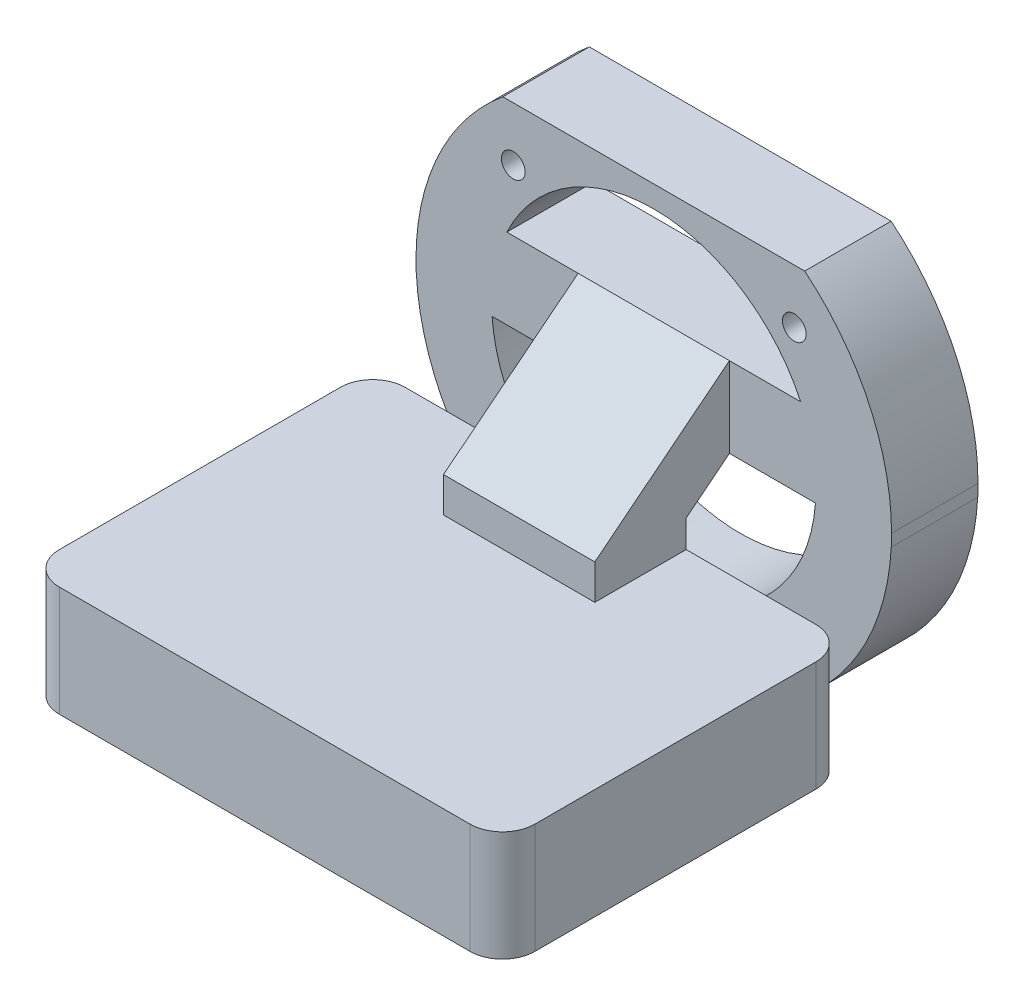
ISO-10303-21;
HEADER;
FILE_DESCRIPTION(('STEP AP214'),'2;1');
FILE_NAME('part.step','',(''),(''),'','','');
FILE_SCHEMA(('AUTOMOTIVE_DESIGN { 1 0 10303 214 1 1 1 1 }'));
ENDSEC;
DATA;
#1=APPLICATION_CONTEXT('core data for automotive mechanical design processes');
#2=APPLICATION_PROTOCOL_DEFINITION('international standard','automotive_design',2000,#1);
#3=PRODUCT_CONTEXT('',#1,'mechanical');
#4=PRODUCT('Part','Part','',(#3));
#5=PRODUCT_RELATED_PRODUCT_CATEGORY('part','',(#4));
#6=PRODUCT_DEFINITION_FORMATION('','',#4);
#7=PRODUCT_DEFINITION_CONTEXT('part definition',#1,'design');
#8=PRODUCT_DEFINITION('design','',#6,#7);
#9=PRODUCT_DEFINITION_SHAPE('','',#8);
#10=(LENGTH_UNIT() NAMED_UNIT(*) SI_UNIT(.MILLI.,.METRE.));
#11=(NAMED_UNIT(*) PLANE_ANGLE_UNIT() SI_UNIT($,.RADIAN.));
#12=(NAMED_UNIT(*) SI_UNIT($,.STERADIAN.) SOLID_ANGLE_UNIT());
#13=UNCERTAINTY_MEASURE_WITH_UNIT(LENGTH_MEASURE(1.E-05),#10,'distance_accuracy_value','');
#14=(GEOMETRIC_REPRESENTATION_CONTEXT(3) GLOBAL_UNCERTAINTY_ASSIGNED_CONTEXT((#13)) GLOBAL_UNIT_ASSIGNED_CONTEXT((#10,
#11,#12)) REPRESENTATION_CONTEXT('',''));
#15=CARTESIAN_POINT('',(0.,0.,0.));
#16=DIRECTION('',(0.,0.,1.));
#17=DIRECTION('',(1.,0.,0.));
#18=AXIS2_PLACEMENT_3D('',#15,#16,#17);
#19=CARTESIAN_POINT('',(22.,0.,0.));
#20=DIRECTION('',(-1.,0.,0.));
#21=DIRECTION('',(0.,0.,1.));
#22=AXIS2_PLACEMENT_3D('',#19,#20,#21);
#23=PLANE('',#22);
#24=DIRECTION('',(0.,0.,1.));
#25=VECTOR('',#24,1.);
#26=CARTESIAN_POINT('',(22.,0.,-7.));
#27=LINE('',#26,#25);
#28=CARTESIAN_POINT('',(22.,0.,0.));
#29=VERTEX_POINT('',#28);
#30=CARTESIAN_POINT('',(22.,0.,8.));
#31=VERTEX_POINT('',#30);
#32=EDGE_CURVE('E234',#29,#31,#27,.T.);
#33=ORIENTED_EDGE('',*,*,#32,.T.);
#34=DIRECTION('',(0.,-1.,0.));
#35=VECTOR('',#34,1.);
#36=CARTESIAN_POINT('',(22.,-6.79999999999999,8.));
#37=LINE('',#36,#35);
#38=CARTESIAN_POINT('',(22.,-1.09337336750485,8.));
#39=VERTEX_POINT('',#38);
#40=EDGE_CURVE('E245',#31,#39,#37,.T.);
#41=ORIENTED_EDGE('',*,*,#40,.T.);
#42=DIRECTION('',(0.,0.,-1.));
#43=VECTOR('',#42,1.);
#44=CARTESIAN_POINT('',(22.,-1.09337336750485,8.));
#45=LINE('',#44,#43);
#46=CARTESIAN_POINT('',(22.,-1.09337336750485,0.));
#47=VERTEX_POINT('',#46);
#48=EDGE_CURVE('E311',#39,#47,#45,.T.);
#49=ORIENTED_EDGE('',*,*,#48,.T.);
#50=DIRECTION('',(0.,1.,0.));
#51=VECTOR('',#50,1.);
#52=CARTESIAN_POINT('',(22.,-1.09337336750485,0.));
#53=LINE('',#52,#51);
#54=EDGE_CURVE('E248',#47,#29,#53,.T.);
#55=ORIENTED_EDGE('',*,*,#54,.T.);
#56=EDGE_LOOP('',(#33,#41,#49,#55));
#57=FACE_BOUND('',#56,.T.);
#58=ADVANCED_FACE('F43',(#57),#23,.F.);
#59=CARTESIAN_POINT('',(-22.,0.,0.));
#60=DIRECTION('',(-1.,0.,0.));
#61=DIRECTION('',(0.,0.,1.));
#62=AXIS2_PLACEMENT_3D('',#59,#60,#61);
#63=PLANE('',#62);
#64=DIRECTION('',(0.,-1.,0.));
#65=VECTOR('',#64,1.);
#66=CARTESIAN_POINT('',(-22.,-6.79999999999999,8.));
#67=LINE('',#66,#65);
#68=CARTESIAN_POINT('',(-22.,0.,8.));
#69=VERTEX_POINT('',#68);
#70=CARTESIAN_POINT('',(-22.,-1.09337336750485,8.));
#71=VERTEX_POINT('',#70);
#72=EDGE_CURVE('E273',#69,#71,#67,.T.);
#73=ORIENTED_EDGE('',*,*,#72,.F.);
#74=DIRECTION('',(0.,0.,1.));
#75=VECTOR('',#74,1.);
#76=CARTESIAN_POINT('',(-22.,0.,-7.));
#77=LINE('',#76,#75);
#78=CARTESIAN_POINT('',(-22.,0.,0.));
#79=VERTEX_POINT('',#78);
#80=EDGE_CURVE('E424',#69,#79,#77,.F.);
#81=ORIENTED_EDGE('',*,*,#80,.T.);
#82=DIRECTION('',(0.,1.,0.));
#83=VECTOR('',#82,1.);
#84=CARTESIAN_POINT('',(-22.,-1.09337336750485,0.));
#85=LINE('',#84,#83);
#86=CARTESIAN_POINT('',(-22.,-1.09337336750485,0.));
#87=VERTEX_POINT('',#86);
#88=EDGE_CURVE('E302',#87,#79,#85,.T.);
#89=ORIENTED_EDGE('',*,*,#88,.F.);
#90=DIRECTION('',(0.,0.,-1.));
#91=VECTOR('',#90,1.);
#92=CARTESIAN_POINT('',(-22.,-1.09337336750485,8.));
#93=LINE('',#92,#91);
#94=EDGE_CURVE('E299',#71,#87,#93,.T.);
#95=ORIENTED_EDGE('',*,*,#94,.F.);
#96=EDGE_LOOP('',(#73,#81,#89,#95));
#97=FACE_BOUND('',#96,.T.);
#98=ADVANCED_FACE('F546',(#97),#63,.T.);
#99=CARTESIAN_POINT('',(22.,-4.27256744270624,12.));
#100=DIRECTION('',(0.,0.782851196509347,0.62220897142671));
#101=DIRECTION('',(0.,-0.62220897142671,0.782851196509347));
#102=AXIS2_PLACEMENT_3D('',#99,#100,#101);
#103=PLANE('',#102);
#104=DIRECTION('',(0.,0.62220897142671,-0.782851196509347));
#105=VECTOR('',#104,1.);
#106=CARTESIAN_POINT('',(7.,-4.27256744270624,12.));
#107=LINE('',#106,#105);
#108=CARTESIAN_POINT('',(7.,-4.27256744270624,12.));
#109=VERTEX_POINT('',#108);
#110=CARTESIAN_POINT('',(7.,-1.09337336750485,8.));
#111=VERTEX_POINT('',#110);
#112=EDGE_CURVE('E269',#109,#111,#107,.T.);
#113=ORIENTED_EDGE('',*,*,#112,.F.);
#114=DIRECTION('',(-1.,0.,0.));
#115=VECTOR('',#114,1.);
#116=CARTESIAN_POINT('',(22.,-4.27256744270624,12.));
#117=LINE('',#116,#115);
#118=CARTESIAN_POINT('',(-7.,-4.27256744270624,12.));
#119=VERTEX_POINT('',#118);
#120=EDGE_CURVE('E344',#109,#119,#117,.T.);
#121=ORIENTED_EDGE('',*,*,#120,.T.);
#122=DIRECTION('',(0.,-0.62220897142671,0.782851196509347));
#123=VECTOR('',#122,1.);
#124=CARTESIAN_POINT('',(-7.,-4.27256744270624,12.));
#125=LINE('',#124,#123);
#126=CARTESIAN_POINT('',(-7.,-1.09337336750485,8.));
#127=VERTEX_POINT('',#126);
#128=EDGE_CURVE('E293',#127,#119,#125,.T.);
#129=ORIENTED_EDGE('',*,*,#128,.F.);
#130=DIRECTION('',(-1.,0.,0.));
#131=VECTOR('',#130,1.);
#132=CARTESIAN_POINT('',(22.,-1.09337336750485,8.));
#133=LINE('',#132,#131);
#134=EDGE_CURVE('E346',#111,#127,#133,.T.);
#135=ORIENTED_EDGE('',*,*,#134,.F.);
#136=EDGE_LOOP('',(#113,#121,#129,#135));
#137=FACE_BOUND('',#136,.T.);
#138=ADVANCED_FACE('F505',(#137),#103,.F.);
#139=CARTESIAN_POINT('',(22.,6.34006583254671,8.));
#140=DIRECTION('',(0.,-0.782851196509347,-0.62220897142671));
#141=DIRECTION('',(0.,0.62220897142671,-0.782851196509347));
#142=AXIS2_PLACEMENT_3D('',#139,#140,#141);
#143=PLANE('',#142);
#144=DIRECTION('',(0.,-0.62220897142671,0.782851196509347));
#145=VECTOR('',#144,1.);
#146=CARTESIAN_POINT('',(7.,6.34006583254671,8.));
#147=LINE('',#146,#145);
#148=CARTESIAN_POINT('',(7.,6.34006583254671,8.));
#149=VERTEX_POINT('',#148);
#150=CARTESIAN_POINT('',(7.,-3.55952705647791,20.4554747585172));
#151=VERTEX_POINT('',#150);
#152=EDGE_CURVE('E271',#149,#151,#147,.T.);
#153=ORIENTED_EDGE('',*,*,#152,.F.);
#154=DIRECTION('',(-1.,0.,0.));
#155=VECTOR('',#154,1.);
#156=CARTESIAN_POINT('',(22.,6.34006583254671,8.));
#157=LINE('',#156,#155);
#158=CARTESIAN_POINT('',(-7.,6.34006583254671,8.));
#159=VERTEX_POINT('',#158);
#160=EDGE_CURVE('E332',#149,#159,#157,.T.);
#161=ORIENTED_EDGE('',*,*,#160,.T.);
#162=DIRECTION('',(0.,0.62220897142671,-0.782851196509347));
#163=VECTOR('',#162,1.);
#164=CARTESIAN_POINT('',(-7.,6.34006583254671,8.));
#165=LINE('',#164,#163);
#166=CARTESIAN_POINT('',(-7.,-3.55952705647791,20.4554747585172));
#167=VERTEX_POINT('',#166);
#168=EDGE_CURVE('E290',#167,#159,#165,.T.);
#169=ORIENTED_EDGE('',*,*,#168,.F.);
#170=DIRECTION('',(-1.,0.,0.));
#171=VECTOR('',#170,1.);
#172=CARTESIAN_POINT('',(22.,-3.55952705647791,20.4554747585172));
#173=LINE('',#172,#171);
#174=EDGE_CURVE('E330',#151,#167,#173,.T.);
#175=ORIENTED_EDGE('',*,*,#174,.F.);
#176=EDGE_LOOP('',(#153,#161,#169,#175));
#177=FACE_BOUND('',#176,.T.);
#178=ADVANCED_FACE('F531',(#177),#143,.F.);
#179=CARTESIAN_POINT('',(22.,-3.55952705647791,20.4554747585172));
#180=DIRECTION('',(0.,0.,-1.));
#181=DIRECTION('',(-1.,0.,0.));
#182=AXIS2_PLACEMENT_3D('',#179,#180,#181);
#183=PLANE('',#182);
#184=DIRECTION('',(0.,1.,0.));
#185=VECTOR('',#184,1.);
#186=CARTESIAN_POINT('',(7.,-6.79999999999999,20.4554747585172));
#187=LINE('',#186,#185);
#188=CARTESIAN_POINT('',(7.,-6.79999999999999,20.4554747585172));
#189=VERTEX_POINT('',#188);
#190=EDGE_CURVE('E256',#189,#151,#187,.T.);
#191=ORIENTED_EDGE('',*,*,#190,.T.);
#192=ORIENTED_EDGE('',*,*,#174,.T.);
#193=DIRECTION('',(0.,1.,0.));
#194=VECTOR('',#193,1.);
#195=CARTESIAN_POINT('',(-7.,-6.79999999999999,20.4554747585172));
#196=LINE('',#195,#194);
#197=CARTESIAN_POINT('',(-7.,-6.79999999999999,20.4554747585172));
#198=VERTEX_POINT('',#197);
#199=EDGE_CURVE('E274',#198,#167,#196,.T.);
#200=ORIENTED_EDGE('',*,*,#199,.F.);
#201=DIRECTION('',(-1.,0.,0.));
#202=VECTOR('',#201,1.);
#203=CARTESIAN_POINT('',(22.,-6.79999999999999,20.4554747585172));
#204=LINE('',#203,#202);
#205=EDGE_CURVE('E328',#189,#198,#204,.T.);
#206=ORIENTED_EDGE('',*,*,#205,.F.);
#207=EDGE_LOOP('',(#191,#192,#200,#206));
#208=FACE_BOUND('',#207,.T.);
#209=ADVANCED_FACE('F534',(#208),#183,.F.);
#210=CARTESIAN_POINT('',(22.,-6.79999999999999,12.));
#211=DIRECTION('',(0.,0.,1.));
#212=DIRECTION('',(1.,0.,0.));
#213=AXIS2_PLACEMENT_3D('',#210,#211,#212);
#214=PLANE('',#213);
#215=DIRECTION('',(-1.,0.,0.));
#216=VECTOR('',#215,1.);
#217=CARTESIAN_POINT('',(22.,-17.,12.));
#218=LINE('',#217,#216);
#219=CARTESIAN_POINT('',(19.,-17.,12.));
#220=VERTEX_POINT('',#219);
#221=CARTESIAN_POINT('',(-19.,-17.,12.));
#222=VERTEX_POINT('',#221);
#223=EDGE_CURVE('E319',#220,#222,#218,.T.);
#224=ORIENTED_EDGE('',*,*,#223,.T.);
#225=DIRECTION('',(0.,1.,0.));
#226=VECTOR('',#225,1.);
#227=CARTESIAN_POINT('',(-19.,-6.79999999999999,12.));
#228=LINE('',#227,#226);
#229=CARTESIAN_POINT('',(-19.,-6.79999999999999,12.));
#230=VERTEX_POINT('',#229);
#231=EDGE_CURVE('E436',#222,#230,#228,.T.);
#232=ORIENTED_EDGE('',*,*,#231,.T.);
#233=DIRECTION('',(1.,0.,0.));
#234=VECTOR('',#233,1.);
#235=CARTESIAN_POINT('',(22.,-6.79999999999999,12.));
#236=LINE('',#235,#234);
#237=CARTESIAN_POINT('',(-7.,-6.79999999999999,12.));
#238=VERTEX_POINT('',#237);
#239=EDGE_CURVE('E288',#230,#238,#236,.T.);
#240=ORIENTED_EDGE('',*,*,#239,.T.);
#241=DIRECTION('',(0.,-1.,0.));
#242=VECTOR('',#241,1.);
#243=CARTESIAN_POINT('',(-7.,-6.79999999999999,12.));
#244=LINE('',#243,#242);
#245=EDGE_CURVE('E296',#119,#238,#244,.T.);
#246=ORIENTED_EDGE('',*,*,#245,.F.);
#247=ORIENTED_EDGE('',*,*,#120,.F.);
#248=DIRECTION('',(0.,1.,0.));
#249=VECTOR('',#248,1.);
#250=CARTESIAN_POINT('',(7.,-6.79999999999999,12.));
#251=LINE('',#250,#249);
#252=CARTESIAN_POINT('',(7.,-6.79999999999999,12.));
#253=VERTEX_POINT('',#252);
#254=EDGE_CURVE('E267',#253,#109,#251,.T.);
#255=ORIENTED_EDGE('',*,*,#254,.F.);
#256=DIRECTION('',(-1.,0.,0.));
#257=VECTOR('',#256,1.);
#258=CARTESIAN_POINT('',(22.,-6.79999999999999,12.));
#259=LINE('',#258,#257);
#260=CARTESIAN_POINT('',(19.,-6.79999999999999,12.));
#261=VERTEX_POINT('',#260);
#262=EDGE_CURVE('E265',#261,#253,#259,.T.);
#263=ORIENTED_EDGE('',*,*,#262,.F.);
#264=DIRECTION('',(0.,1.,0.));
#265=VECTOR('',#264,1.);
#266=CARTESIAN_POINT('',(19.,-6.79999999999999,12.));
#267=LINE('',#266,#265);
#268=EDGE_CURVE('E430',#261,#220,#267,.F.);
#269=ORIENTED_EDGE('',*,*,#268,.T.);
#270=EDGE_LOOP('',(#224,#232,#240,#246,#247,#255,#263,#269));
#271=FACE_BOUND('',#270,.T.);
#272=ADVANCED_FACE('F489',(#271),#214,.F.);
#273=DIRECTION('',(0.,0.,-1.));
#274=VECTOR('',#273,1.);
#275=CARTESIAN_POINT('',(22.,-17.,12.));
#276=LINE('',#275,#274);
#277=CARTESIAN_POINT('',(22.,-17.,41.));
#278=VERTEX_POINT('',#277);
#279=CARTESIAN_POINT('',(22.,-17.,15.));
#280=VERTEX_POINT('',#279);
#281=EDGE_CURVE('E317',#278,#280,#276,.T.);
#282=ORIENTED_EDGE('',*,*,#281,.T.);
#283=DIRECTION('',(0.,1.,0.));
#284=VECTOR('',#283,1.);
#285=CARTESIAN_POINT('',(22.,0.,15.));
#286=LINE('',#285,#284);
#287=CARTESIAN_POINT('',(22.,-6.79999999999999,15.));
#288=VERTEX_POINT('',#287);
#289=EDGE_CURVE('E11',#280,#288,#286,.T.);
#290=ORIENTED_EDGE('',*,*,#289,.T.);
#291=DIRECTION('',(0.,0.,1.));
#292=VECTOR('',#291,1.);
#293=CARTESIAN_POINT('',(22.,-6.79999999999999,20.4554747585172));
#294=LINE('',#293,#292);
#295=CARTESIAN_POINT('',(22.,-6.8,41.));
#296=VERTEX_POINT('',#295);
#297=EDGE_CURVE('E314',#288,#296,#294,.T.);
#298=ORIENTED_EDGE('',*,*,#297,.T.);
#299=DIRECTION('',(0.,-1.,0.));
#300=VECTOR('',#299,1.);
#301=CARTESIAN_POINT('',(22.,0.,41.));
#302=LINE('',#301,#300);
#303=EDGE_CURVE('E51',#296,#278,#302,.T.);
#304=ORIENTED_EDGE('',*,*,#303,.T.);
#305=EDGE_LOOP('',(#282,#290,#298,#304));
#306=FACE_BOUND('',#305,.T.);
#307=ADVANCED_FACE('F462',(#306),#23,.F.);
#308=DIRECTION('',(0.,0.,1.));
#309=VECTOR('',#308,1.);
#310=CARTESIAN_POINT('',(-22.,-6.79999999999999,20.4554747585172));
#311=LINE('',#310,#309);
#312=CARTESIAN_POINT('',(-22.,-6.79999999999999,15.));
#313=VERTEX_POINT('',#312);
#314=CARTESIAN_POINT('',(-22.,-6.8,41.));
#315=VERTEX_POINT('',#314);
#316=EDGE_CURVE('E305',#313,#315,#311,.T.);
#317=ORIENTED_EDGE('',*,*,#316,.F.);
#318=DIRECTION('',(0.,1.,0.));
#319=VECTOR('',#318,1.);
#320=CARTESIAN_POINT('',(-22.,-17.,15.));
#321=LINE('',#320,#319);
#322=CARTESIAN_POINT('',(-22.,-17.,15.));
#323=VERTEX_POINT('',#322);
#324=EDGE_CURVE('E449',#313,#323,#321,.F.);
#325=ORIENTED_EDGE('',*,*,#324,.T.);
#326=DIRECTION('',(0.,0.,-1.));
#327=VECTOR('',#326,1.);
#328=CARTESIAN_POINT('',(-22.,-17.,12.));
#329=LINE('',#328,#327);
#330=CARTESIAN_POINT('',(-22.,-17.,41.));
#331=VERTEX_POINT('',#330);
#332=EDGE_CURVE('E308',#331,#323,#329,.T.);
#333=ORIENTED_EDGE('',*,*,#332,.F.);
#334=DIRECTION('',(0.,-1.,0.));
#335=VECTOR('',#334,1.);
#336=CARTESIAN_POINT('',(-22.,-6.8,41.));
#337=LINE('',#336,#335);
#338=EDGE_CURVE('E447',#331,#315,#337,.F.);
#339=ORIENTED_EDGE('',*,*,#338,.T.);
#340=EDGE_LOOP('',(#317,#325,#333,#339));
#341=FACE_BOUND('',#340,.T.);
#342=ADVANCED_FACE('F483',(#341),#63,.T.);
#343=CARTESIAN_POINT('',(0.,0.,8.));
#344=DIRECTION('',(0.,0.,1.));
#345=DIRECTION('',(1.,0.,0.));
#346=AXIS2_PLACEMENT_3D('',#343,#344,#345);
#347=PLANE('',#346);
#348=ORIENTED_EDGE('',*,*,#40,.F.);
#349=CARTESIAN_POINT('',(0.,0.,8.));
#350=DIRECTION('',(0.,0.,1.));
#351=DIRECTION('',(1.,0.,0.));
#352=AXIS2_PLACEMENT_3D('',#349,#350,#351);
#353=CIRCLE('',#352,22.);
#354=CARTESIAN_POINT('',(13.9642400437689,17.,8.));
#355=VERTEX_POINT('',#354);
#356=EDGE_CURVE('E231',#31,#355,#353,.T.);
#357=ORIENTED_EDGE('',*,*,#356,.T.);
#358=DIRECTION('',(-1.,0.,0.));
#359=VECTOR('',#358,1.);
#360=CARTESIAN_POINT('',(13.9642400437689,17.,8.));
#361=LINE('',#360,#359);
#362=CARTESIAN_POINT('',(-13.9642400437689,17.,8.));
#363=VERTEX_POINT('',#362);
#364=EDGE_CURVE('E390',#355,#363,#361,.T.);
#365=ORIENTED_EDGE('',*,*,#364,.T.);
#366=CARTESIAN_POINT('',(0.,0.,8.));
#367=DIRECTION('',(0.,0.,1.));
#368=DIRECTION('',(1.,0.,0.));
#369=AXIS2_PLACEMENT_3D('',#366,#367,#368);
#370=CIRCLE('',#369,22.);
#371=EDGE_CURVE('E386',#363,#69,#370,.T.);
#372=ORIENTED_EDGE('',*,*,#371,.T.);
#373=ORIENTED_EDGE('',*,*,#72,.T.);
#374=CARTESIAN_POINT('',(-21.9728135358045,-1.09337336750485,8.));
#375=VERTEX_POINT('',#374);
#376=EDGE_CURVE('E341',#375,#71,#133,.T.);
#377=ORIENTED_EDGE('',*,*,#376,.F.);
#378=CARTESIAN_POINT('',(-13.9642400437689,-17.,8.));
#379=VERTEX_POINT('',#378);
#380=EDGE_CURVE('E388',#375,#379,#370,.T.);
#381=ORIENTED_EDGE('',*,*,#380,.T.);
#382=DIRECTION('',(1.,0.,0.));
#383=VECTOR('',#382,1.);
#384=CARTESIAN_POINT('',(13.9642400437689,-17.,8.));
#385=LINE('',#384,#383);
#386=CARTESIAN_POINT('',(13.9642400437689,-17.,8.));
#387=VERTEX_POINT('',#386);
#388=EDGE_CURVE('E242',#379,#387,#385,.T.);
#389=ORIENTED_EDGE('',*,*,#388,.T.);
#390=CARTESIAN_POINT('',(21.9728135358045,-1.09337336750485,8.));
#391=VERTEX_POINT('',#390);
#392=EDGE_CURVE('E241',#387,#391,#353,.T.);
#393=ORIENTED_EDGE('',*,*,#392,.T.);
#394=EDGE_CURVE('E254',#39,#391,#133,.T.);
#395=ORIENTED_EDGE('',*,*,#394,.F.);
#396=EDGE_LOOP('',(#348,#357,#365,#372,#373,#377,#381,#389,#393,#395));
#397=FACE_BOUND('',#396,.T.);
#398=CARTESIAN_POINT('',(14.9600980838774,-1.09337336750485,8.));
#399=VERTEX_POINT('',#398);
#400=EDGE_CURVE('E345',#399,#111,#133,.T.);
#401=ORIENTED_EDGE('',*,*,#400,.F.);
#402=CARTESIAN_POINT('',(0.,0.,8.));
#403=DIRECTION('',(0.,0.,1.));
#404=DIRECTION('',(1.,0.,0.));
#405=AXIS2_PLACEMENT_3D('',#402,#403,#404);
#406=CIRCLE('',#405,15.);
#407=CARTESIAN_POINT('',(-14.9600980838774,-1.09337336750485,8.));
#408=VERTEX_POINT('',#407);
#409=EDGE_CURVE('E382',#408,#399,#406,.T.);
#410=ORIENTED_EDGE('',*,*,#409,.F.);
#411=DIRECTION('',(-1.,0.,0.));
#412=VECTOR('',#411,1.);
#413=CARTESIAN_POINT('',(22.,-1.09337336750485,8.));
#414=LINE('',#413,#412);
#415=EDGE_CURVE('E286',#127,#408,#414,.T.);
#416=ORIENTED_EDGE('',*,*,#415,.F.);
#417=DIRECTION('',(0.,-1.,0.));
#418=VECTOR('',#417,1.);
#419=CARTESIAN_POINT('',(-7.,-6.79999999999999,8.));
#420=LINE('',#419,#418);
#421=EDGE_CURVE('E277',#159,#127,#420,.T.);
#422=ORIENTED_EDGE('',*,*,#421,.F.);
#423=DIRECTION('',(-1.,0.,0.));
#424=VECTOR('',#423,1.);
#425=CARTESIAN_POINT('',(-7.,6.34006583254671,8.));
#426=LINE('',#425,#424);
#427=CARTESIAN_POINT('',(-13.5942475054331,6.34006583254671,8.));
#428=VERTEX_POINT('',#427);
#429=EDGE_CURVE('E283',#159,#428,#426,.T.);
#430=ORIENTED_EDGE('',*,*,#429,.T.);
#431=CARTESIAN_POINT('',(13.5942475054331,6.34006583254671,8.));
#432=VERTEX_POINT('',#431);
#433=EDGE_CURVE('E378',#432,#428,#406,.T.);
#434=ORIENTED_EDGE('',*,*,#433,.F.);
#435=EDGE_CURVE('E334',#432,#149,#157,.T.);
#436=ORIENTED_EDGE('',*,*,#435,.T.);
#437=DIRECTION('',(0.,-1.,0.));
#438=VECTOR('',#437,1.);
#439=CARTESIAN_POINT('',(7.,-6.79999999999999,8.));
#440=LINE('',#439,#438);
#441=EDGE_CURVE('E263',#149,#111,#440,.T.);
#442=ORIENTED_EDGE('',*,*,#441,.T.);
#443=EDGE_LOOP('',(#401,#410,#416,#422,#430,#434,#436,#442));
#444=FACE_BOUND('',#443,.T.);
#445=CARTESIAN_POINT('',(13.,12.,8.));
#446=DIRECTION('',(0.,0.,1.));
#447=DIRECTION('',(1.,0.,0.));
#448=AXIS2_PLACEMENT_3D('',#445,#446,#447);
#449=CIRCLE('',#448,1.1);
#450=CARTESIAN_POINT('',(14.1,12.,8.));
#451=VERTEX_POINT('',#450);
#452=EDGE_CURVE('E366',#451,#451,#449,.T.);
#453=ORIENTED_EDGE('',*,*,#452,.F.);
#454=EDGE_LOOP('',(#453));
#455=FACE_BOUND('',#454,.T.);
#456=CARTESIAN_POINT('',(-13.,12.,8.));
#457=DIRECTION('',(0.,0.,1.));
#458=DIRECTION('',(1.,0.,0.));
#459=AXIS2_PLACEMENT_3D('',#456,#457,#458);
#460=CIRCLE('',#459,1.1);
#461=CARTESIAN_POINT('',(-11.9,12.,8.));
#462=VERTEX_POINT('',#461);
#463=EDGE_CURVE('E372',#462,#462,#460,.T.);
#464=ORIENTED_EDGE('',*,*,#463,.F.);
#465=EDGE_LOOP('',(#464));
#466=FACE_BOUND('',#465,.T.);
#467=CARTESIAN_POINT('',(13.,-12.,8.));
#468=DIRECTION('',(0.,0.,1.));
#469=DIRECTION('',(1.,0.,0.));
#470=AXIS2_PLACEMENT_3D('',#467,#468,#469);
#471=CIRCLE('',#470,1.1);
#472=CARTESIAN_POINT('',(14.1,-12.,8.));
#473=VERTEX_POINT('',#472);
#474=EDGE_CURVE('E360',#473,#473,#471,.T.);
#475=ORIENTED_EDGE('',*,*,#474,.F.);
#476=EDGE_LOOP('',(#475));
#477=FACE_BOUND('',#476,.T.);
#478=CARTESIAN_POINT('',(-13.,-12.,8.));
#479=DIRECTION('',(0.,0.,1.));
#480=DIRECTION('',(1.,0.,0.));
#481=AXIS2_PLACEMENT_3D('',#478,#479,#480);
#482=CIRCLE('',#481,1.1);
#483=CARTESIAN_POINT('',(-11.9,-12.,8.));
#484=VERTEX_POINT('',#483);
#485=EDGE_CURVE('E354',#484,#484,#482,.T.);
#486=ORIENTED_EDGE('',*,*,#485,.F.);
#487=EDGE_LOOP('',(#486));
#488=FACE_BOUND('',#487,.T.);
#489=ADVANCED_FACE('F251',(#397,#444,#455,#466,#477,#488),#347,.T.);
#490=CARTESIAN_POINT('',(0.,0.,8.));
#491=DIRECTION('',(0.,0.,-1.));
#492=DIRECTION('',(-1.,0.,0.));
#493=AXIS2_PLACEMENT_3D('',#490,#491,#492);
#494=CYLINDRICAL_SURFACE('',#493,22.);
#495=DIRECTION('',(0.,0.,-1.));
#496=VECTOR('',#495,1.);
#497=CARTESIAN_POINT('',(-21.9728135358045,-1.09337336750485,8.));
#498=LINE('',#497,#496);
#499=CARTESIAN_POINT('',(-21.9728135358045,-1.09337336750485,0.));
#500=VERTEX_POINT('',#499);
#501=EDGE_CURVE('E350',#500,#375,#498,.F.);
#502=ORIENTED_EDGE('',*,*,#501,.F.);
#503=CARTESIAN_POINT('',(0.,0.,0.));
#504=DIRECTION('',(0.,0.,1.));
#505=DIRECTION('',(1.,0.,0.));
#506=AXIS2_PLACEMENT_3D('',#503,#504,#505);
#507=CIRCLE('',#506,22.);
#508=CARTESIAN_POINT('',(-13.9642400437689,-17.,0.));
#509=VERTEX_POINT('',#508);
#510=EDGE_CURVE('E381',#500,#509,#507,.T.);
#511=ORIENTED_EDGE('',*,*,#510,.T.);
#512=DIRECTION('',(0.,0.,-1.));
#513=VECTOR('',#512,1.);
#514=CARTESIAN_POINT('',(-13.9642400437689,-17.,8.));
#515=LINE('',#514,#513);
#516=EDGE_CURVE('E409',#379,#509,#515,.T.);
#517=ORIENTED_EDGE('',*,*,#516,.F.);
#518=ORIENTED_EDGE('',*,*,#380,.F.);
#519=EDGE_LOOP('',(#502,#511,#517,#518));
#520=FACE_BOUND('',#519,.T.);
#521=ADVANCED_FACE('F563',(#520),#494,.T.);
#522=CARTESIAN_POINT('',(-13.9642400437689,17.,0.));
#523=VERTEX_POINT('',#522);
#524=EDGE_CURVE('E393',#523,#79,#507,.T.);
#525=ORIENTED_EDGE('',*,*,#524,.T.);
#526=ORIENTED_EDGE('',*,*,#80,.F.);
#527=ORIENTED_EDGE('',*,*,#371,.F.);
#528=DIRECTION('',(0.,0.,-1.));
#529=VECTOR('',#528,1.);
#530=CARTESIAN_POINT('',(-13.9642400437689,17.,8.));
#531=LINE('',#530,#529);
#532=EDGE_CURVE('E392',#363,#523,#531,.T.);
#533=ORIENTED_EDGE('',*,*,#532,.T.);
#534=EDGE_LOOP('',(#525,#526,#527,#533));
#535=FACE_BOUND('',#534,.T.);
#536=ADVANCED_FACE('F650',(#535),#494,.T.);
#537=CARTESIAN_POINT('',(0.,0.,8.));
#538=DIRECTION('',(0.,0.,-1.));
#539=DIRECTION('',(-1.,0.,0.));
#540=AXIS2_PLACEMENT_3D('',#537,#538,#539);
#541=CYLINDRICAL_SURFACE('',#540,22.);
#542=DIRECTION('',(0.,0.,-1.));
#543=VECTOR('',#542,1.);
#544=CARTESIAN_POINT('',(21.9728135358045,-1.09337336750485,8.));
#545=LINE('',#544,#543);
#546=CARTESIAN_POINT('',(21.9728135358045,-1.09337336750485,0.));
#547=VERTEX_POINT('',#546);
#548=EDGE_CURVE('E348',#391,#547,#545,.T.);
#549=ORIENTED_EDGE('',*,*,#548,.F.);
#550=ORIENTED_EDGE('',*,*,#392,.F.);
#551=DIRECTION('',(0.,0.,-1.));
#552=VECTOR('',#551,1.);
#553=CARTESIAN_POINT('',(13.9642400437689,-17.,8.));
#554=LINE('',#553,#552);
#555=CARTESIAN_POINT('',(13.9642400437689,-17.,0.));
#556=VERTEX_POINT('',#555);
#557=EDGE_CURVE('E406',#387,#556,#554,.T.);
#558=ORIENTED_EDGE('',*,*,#557,.T.);
#559=CARTESIAN_POINT('',(0.,0.,0.));
#560=DIRECTION('',(0.,0.,1.));
#561=DIRECTION('',(1.,0.,0.));
#562=AXIS2_PLACEMENT_3D('',#559,#560,#561);
#563=CIRCLE('',#562,22.);
#564=EDGE_CURVE('E398',#556,#547,#563,.T.);
#565=ORIENTED_EDGE('',*,*,#564,.T.);
#566=EDGE_LOOP('',(#549,#550,#558,#565));
#567=FACE_BOUND('',#566,.T.);
#568=ADVANCED_FACE('F648',(#567),#541,.T.);
#569=ORIENTED_EDGE('',*,*,#356,.F.);
#570=ORIENTED_EDGE('',*,*,#32,.F.);
#571=CARTESIAN_POINT('',(13.9642400437689,17.,0.));
#572=VERTEX_POINT('',#571);
#573=EDGE_CURVE('E397',#29,#572,#563,.T.);
#574=ORIENTED_EDGE('',*,*,#573,.T.);
#575=DIRECTION('',(0.,0.,-1.));
#576=VECTOR('',#575,1.);
#577=CARTESIAN_POINT('',(13.9642400437689,17.,8.));
#578=LINE('',#577,#576);
#579=EDGE_CURVE('E237',#355,#572,#578,.T.);
#580=ORIENTED_EDGE('',*,*,#579,.F.);
#581=EDGE_LOOP('',(#569,#570,#574,#580));
#582=FACE_BOUND('',#581,.T.);
#583=ADVANCED_FACE('F233',(#582),#541,.T.);
#584=CARTESIAN_POINT('',(0.,0.,8.));
#585=DIRECTION('',(0.,0.,-1.));
#586=DIRECTION('',(-1.,0.,0.));
#587=AXIS2_PLACEMENT_3D('',#584,#585,#586);
#588=CYLINDRICAL_SURFACE('',#587,15.);
#589=ORIENTED_EDGE('',*,*,#409,.T.);
#590=DIRECTION('',(0.,0.,-1.));
#591=VECTOR('',#590,1.);
#592=CARTESIAN_POINT('',(14.9600980838774,-1.09337336750485,8.));
#593=LINE('',#592,#591);
#594=CARTESIAN_POINT('',(14.9600980838774,-1.09337336750485,0.));
#595=VERTEX_POINT('',#594);
#596=EDGE_CURVE('E421',#399,#595,#593,.T.);
#597=ORIENTED_EDGE('',*,*,#596,.T.);
#598=CARTESIAN_POINT('',(0.,0.,0.));
#599=DIRECTION('',(0.,0.,1.));
#600=DIRECTION('',(1.,0.,0.));
#601=AXIS2_PLACEMENT_3D('',#598,#599,#600);
#602=CIRCLE('',#601,15.);
#603=CARTESIAN_POINT('',(-14.9600980838774,-1.09337336750485,0.));
#604=VERTEX_POINT('',#603);
#605=EDGE_CURVE('E375',#604,#595,#602,.T.);
#606=ORIENTED_EDGE('',*,*,#605,.F.);
#607=DIRECTION('',(0.,0.,-1.));
#608=VECTOR('',#607,1.);
#609=CARTESIAN_POINT('',(-14.9600980838774,-1.09337336750485,8.));
#610=LINE('',#609,#608);
#611=EDGE_CURVE('E418',#604,#408,#610,.F.);
#612=ORIENTED_EDGE('',*,*,#611,.T.);
#613=EDGE_LOOP('',(#589,#597,#606,#612));
#614=FACE_BOUND('',#613,.T.);
#615=ADVANCED_FACE('F636',(#614),#588,.F.);
#616=ORIENTED_EDGE('',*,*,#433,.T.);
#617=DIRECTION('',(0.,0.,-1.));
#618=VECTOR('',#617,1.);
#619=CARTESIAN_POINT('',(-13.5942475054331,6.34006583254671,8.));
#620=LINE('',#619,#618);
#621=CARTESIAN_POINT('',(-13.5942475054331,6.34006583254671,0.));
#622=VERTEX_POINT('',#621);
#623=EDGE_CURVE('E415',#428,#622,#620,.T.);
#624=ORIENTED_EDGE('',*,*,#623,.T.);
#625=CARTESIAN_POINT('',(13.5942475054331,6.34006583254671,0.));
#626=VERTEX_POINT('',#625);
#627=EDGE_CURVE('E383',#626,#622,#602,.T.);
#628=ORIENTED_EDGE('',*,*,#627,.F.);
#629=DIRECTION('',(0.,0.,-1.));
#630=VECTOR('',#629,1.);
#631=CARTESIAN_POINT('',(13.5942475054331,6.34006583254671,8.));
#632=LINE('',#631,#630);
#633=EDGE_CURVE('E412',#626,#432,#632,.F.);
#634=ORIENTED_EDGE('',*,*,#633,.T.);
#635=EDGE_LOOP('',(#616,#624,#628,#634));
#636=FACE_BOUND('',#635,.T.);
#637=ADVANCED_FACE('F525',(#636),#588,.F.);
#638=CARTESIAN_POINT('',(0.,0.,0.));
#639=DIRECTION('',(0.,0.,1.));
#640=DIRECTION('',(1.,0.,0.));
#641=AXIS2_PLACEMENT_3D('',#638,#639,#640);
#642=PLANE('',#641);
#643=ORIENTED_EDGE('',*,*,#605,.T.);
#644=DIRECTION('',(-1.,0.,0.));
#645=VECTOR('',#644,1.);
#646=CARTESIAN_POINT('',(22.,-1.09337336750485,0.));
#647=LINE('',#646,#645);
#648=EDGE_CURVE('E342',#595,#604,#647,.T.);
#649=ORIENTED_EDGE('',*,*,#648,.T.);
#650=EDGE_LOOP('',(#643,#649));
#651=FACE_BOUND('',#650,.T.);
#652=ORIENTED_EDGE('',*,*,#627,.T.);
#653=DIRECTION('',(-1.,0.,0.));
#654=VECTOR('',#653,1.);
#655=CARTESIAN_POINT('',(22.,6.34006583254671,0.));
#656=LINE('',#655,#654);
#657=EDGE_CURVE('E335',#626,#622,#656,.T.);
#658=ORIENTED_EDGE('',*,*,#657,.F.);
#659=EDGE_LOOP('',(#652,#658));
#660=FACE_BOUND('',#659,.T.);
#661=ORIENTED_EDGE('',*,*,#573,.F.);
#662=ORIENTED_EDGE('',*,*,#54,.F.);
#663=EDGE_CURVE('E338',#47,#547,#647,.T.);
#664=ORIENTED_EDGE('',*,*,#663,.T.);
#665=ORIENTED_EDGE('',*,*,#564,.F.);
#666=DIRECTION('',(1.,0.,0.));
#667=VECTOR('',#666,1.);
#668=CARTESIAN_POINT('',(13.9642400437689,-17.,0.));
#669=LINE('',#668,#667);
#670=EDGE_CURVE('E395',#509,#556,#669,.T.);
#671=ORIENTED_EDGE('',*,*,#670,.F.);
#672=ORIENTED_EDGE('',*,*,#510,.F.);
#673=EDGE_CURVE('E337',#500,#87,#647,.T.);
#674=ORIENTED_EDGE('',*,*,#673,.T.);
#675=ORIENTED_EDGE('',*,*,#88,.T.);
#676=ORIENTED_EDGE('',*,*,#524,.F.);
#677=DIRECTION('',(-1.,0.,0.));
#678=VECTOR('',#677,1.);
#679=CARTESIAN_POINT('',(13.9642400437689,17.,0.));
#680=LINE('',#679,#678);
#681=EDGE_CURVE('E401',#572,#523,#680,.T.);
#682=ORIENTED_EDGE('',*,*,#681,.F.);
#683=EDGE_LOOP('',(#661,#662,#664,#665,#671,#672,#674,#675,#676,#682));
#684=FACE_BOUND('',#683,.T.);
#685=CARTESIAN_POINT('',(13.,12.,0.));
#686=DIRECTION('',(0.,0.,1.));
#687=DIRECTION('',(1.,0.,0.));
#688=AXIS2_PLACEMENT_3D('',#685,#686,#687);
#689=CIRCLE('',#688,1.1);
#690=CARTESIAN_POINT('',(14.1,12.,0.));
#691=VERTEX_POINT('',#690);
#692=EDGE_CURVE('E363',#691,#691,#689,.T.);
#693=ORIENTED_EDGE('',*,*,#692,.T.);
#694=EDGE_LOOP('',(#693));
#695=FACE_BOUND('',#694,.T.);
#696=CARTESIAN_POINT('',(-13.,12.,0.));
#697=DIRECTION('',(0.,0.,1.));
#698=DIRECTION('',(1.,0.,0.));
#699=AXIS2_PLACEMENT_3D('',#696,#697,#698);
#700=CIRCLE('',#699,1.1);
#701=CARTESIAN_POINT('',(-11.9,12.,0.));
#702=VERTEX_POINT('',#701);
#703=EDGE_CURVE('E369',#702,#702,#700,.T.);
#704=ORIENTED_EDGE('',*,*,#703,.T.);
#705=EDGE_LOOP('',(#704));
#706=FACE_BOUND('',#705,.T.);
#707=CARTESIAN_POINT('',(13.,-12.,0.));
#708=DIRECTION('',(0.,0.,1.));
#709=DIRECTION('',(1.,0.,0.));
#710=AXIS2_PLACEMENT_3D('',#707,#708,#709);
#711=CIRCLE('',#710,1.1);
#712=CARTESIAN_POINT('',(14.1,-12.,0.));
#713=VERTEX_POINT('',#712);
#714=EDGE_CURVE('E357',#713,#713,#711,.T.);
#715=ORIENTED_EDGE('',*,*,#714,.T.);
#716=EDGE_LOOP('',(#715));
#717=FACE_BOUND('',#716,.T.);
#718=CARTESIAN_POINT('',(-13.,-12.,0.));
#719=DIRECTION('',(0.,0.,1.));
#720=DIRECTION('',(1.,0.,0.));
#721=AXIS2_PLACEMENT_3D('',#718,#719,#720);
#722=CIRCLE('',#721,1.1);
#723=CARTESIAN_POINT('',(-11.9,-12.,0.));
#724=VERTEX_POINT('',#723);
#725=EDGE_CURVE('E353',#724,#724,#722,.T.);
#726=ORIENTED_EDGE('',*,*,#725,.T.);
#727=EDGE_LOOP('',(#726));
#728=FACE_BOUND('',#727,.T.);
#729=ADVANCED_FACE('F640',(#651,#660,#684,#695,#706,#717,#728),#642,.F.);
#730=CARTESIAN_POINT('',(13.9642400437689,-17.,8.));
#731=DIRECTION('',(0.,1.,0.));
#732=DIRECTION('',(-1.,0.,0.));
#733=AXIS2_PLACEMENT_3D('',#730,#731,#732);
#734=PLANE('',#733);
#735=ORIENTED_EDGE('',*,*,#670,.T.);
#736=ORIENTED_EDGE('',*,*,#557,.F.);
#737=ORIENTED_EDGE('',*,*,#388,.F.);
#738=ORIENTED_EDGE('',*,*,#516,.T.);
#739=EDGE_LOOP('',(#735,#736,#737,#738));
#740=FACE_BOUND('',#739,.T.);
#741=ADVANCED_FACE('F643',(#740),#734,.F.);
#742=CARTESIAN_POINT('',(13.9642400437689,17.,8.));
#743=DIRECTION('',(0.,-1.,0.));
#744=DIRECTION('',(1.,0.,0.));
#745=AXIS2_PLACEMENT_3D('',#742,#743,#744);
#746=PLANE('',#745);
#747=ORIENTED_EDGE('',*,*,#681,.T.);
#748=ORIENTED_EDGE('',*,*,#532,.F.);
#749=ORIENTED_EDGE('',*,*,#364,.F.);
#750=ORIENTED_EDGE('',*,*,#579,.T.);
#751=EDGE_LOOP('',(#747,#748,#749,#750));
#752=FACE_BOUND('',#751,.T.);
#753=ADVANCED_FACE('F634',(#752),#746,.F.);
#754=CARTESIAN_POINT('',(-13.,12.,8.));
#755=DIRECTION('',(0.,0.,-1.));
#756=DIRECTION('',(-1.,0.,0.));
#757=AXIS2_PLACEMENT_3D('',#754,#755,#756);
#758=CYLINDRICAL_SURFACE('',#757,1.1);
#759=ORIENTED_EDGE('',*,*,#463,.T.);
#760=EDGE_LOOP('',(#759));
#761=FACE_BOUND('',#760,.T.);
#762=ORIENTED_EDGE('',*,*,#703,.F.);
#763=EDGE_LOOP('',(#762));
#764=FACE_BOUND('',#763,.T.);
#765=ADVANCED_FACE('F630',(#761,#764),#758,.F.);
#766=CARTESIAN_POINT('',(13.,12.,8.));
#767=DIRECTION('',(0.,0.,-1.));
#768=DIRECTION('',(-1.,0.,0.));
#769=AXIS2_PLACEMENT_3D('',#766,#767,#768);
#770=CYLINDRICAL_SURFACE('',#769,1.1);
#771=ORIENTED_EDGE('',*,*,#452,.T.);
#772=EDGE_LOOP('',(#771));
#773=FACE_BOUND('',#772,.T.);
#774=ORIENTED_EDGE('',*,*,#692,.F.);
#775=EDGE_LOOP('',(#774));
#776=FACE_BOUND('',#775,.T.);
#777=ADVANCED_FACE('F626',(#773,#776),#770,.F.);
#778=CARTESIAN_POINT('',(13.,-12.,8.));
#779=DIRECTION('',(0.,0.,-1.));
#780=DIRECTION('',(-1.,0.,0.));
#781=AXIS2_PLACEMENT_3D('',#778,#779,#780);
#782=CYLINDRICAL_SURFACE('',#781,1.1);
#783=ORIENTED_EDGE('',*,*,#474,.T.);
#784=EDGE_LOOP('',(#783));
#785=FACE_BOUND('',#784,.T.);
#786=ORIENTED_EDGE('',*,*,#714,.F.);
#787=EDGE_LOOP('',(#786));
#788=FACE_BOUND('',#787,.T.);
#789=ADVANCED_FACE('F622',(#785,#788),#782,.F.);
#790=CARTESIAN_POINT('',(-13.,-12.,8.));
#791=DIRECTION('',(0.,0.,-1.));
#792=DIRECTION('',(-1.,0.,0.));
#793=AXIS2_PLACEMENT_3D('',#790,#791,#792);
#794=CYLINDRICAL_SURFACE('',#793,1.1);
#795=ORIENTED_EDGE('',*,*,#485,.T.);
#796=EDGE_LOOP('',(#795));
#797=FACE_BOUND('',#796,.T.);
#798=ORIENTED_EDGE('',*,*,#725,.F.);
#799=EDGE_LOOP('',(#798));
#800=FACE_BOUND('',#799,.T.);
#801=ADVANCED_FACE('F619',(#797,#800),#794,.F.);
#802=CARTESIAN_POINT('',(22.,-1.09337336750485,8.));
#803=DIRECTION('',(0.,1.,0.));
#804=DIRECTION('',(0.,0.,1.));
#805=AXIS2_PLACEMENT_3D('',#802,#803,#804);
#806=PLANE('',#805);
#807=ORIENTED_EDGE('',*,*,#673,.F.);
#808=ORIENTED_EDGE('',*,*,#501,.T.);
#809=ORIENTED_EDGE('',*,*,#376,.T.);
#810=ORIENTED_EDGE('',*,*,#94,.T.);
#811=EDGE_LOOP('',(#807,#808,#809,#810));
#812=FACE_BOUND('',#811,.T.);
#813=ADVANCED_FACE('F615',(#812),#806,.F.);
#814=ORIENTED_EDGE('',*,*,#394,.T.);
#815=ORIENTED_EDGE('',*,*,#548,.T.);
#816=ORIENTED_EDGE('',*,*,#663,.F.);
#817=ORIENTED_EDGE('',*,*,#48,.F.);
#818=EDGE_LOOP('',(#814,#815,#816,#817));
#819=FACE_BOUND('',#818,.T.);
#820=ADVANCED_FACE('F612',(#819),#806,.F.);
#821=ORIENTED_EDGE('',*,*,#596,.F.);
#822=ORIENTED_EDGE('',*,*,#400,.T.);
#823=ORIENTED_EDGE('',*,*,#134,.T.);
#824=ORIENTED_EDGE('',*,*,#415,.T.);
#825=ORIENTED_EDGE('',*,*,#611,.F.);
#826=ORIENTED_EDGE('',*,*,#648,.F.);
#827=EDGE_LOOP('',(#821,#822,#823,#824,#825,#826));
#828=FACE_BOUND('',#827,.T.);
#829=ADVANCED_FACE('F607',(#828),#806,.F.);
#830=CARTESIAN_POINT('',(22.,6.34006583254671,8.));
#831=DIRECTION('',(0.,-1.,0.));
#832=DIRECTION('',(0.,0.,-1.));
#833=AXIS2_PLACEMENT_3D('',#830,#831,#832);
#834=PLANE('',#833);
#835=ORIENTED_EDGE('',*,*,#623,.F.);
#836=ORIENTED_EDGE('',*,*,#429,.F.);
#837=ORIENTED_EDGE('',*,*,#160,.F.);
#838=ORIENTED_EDGE('',*,*,#435,.F.);
#839=ORIENTED_EDGE('',*,*,#633,.F.);
#840=ORIENTED_EDGE('',*,*,#657,.T.);
#841=EDGE_LOOP('',(#835,#836,#837,#838,#839,#840));
#842=FACE_BOUND('',#841,.T.);
#843=ADVANCED_FACE('F521',(#842),#834,.F.);
#844=CARTESIAN_POINT('',(22.,-6.79999999999999,20.4554747585172));
#845=DIRECTION('',(0.,-1.,0.));
#846=DIRECTION('',(0.,0.,-1.));
#847=AXIS2_PLACEMENT_3D('',#844,#845,#846);
#848=PLANE('',#847);
#849=ORIENTED_EDGE('',*,*,#239,.F.);
#850=CARTESIAN_POINT('',(-19.,-6.79999999999999,15.));
#851=DIRECTION('',(0.,-1.,0.));
#852=DIRECTION('',(0.,0.,-1.));
#853=AXIS2_PLACEMENT_3D('',#850,#851,#852);
#854=CIRCLE('',#853,3.);
#855=EDGE_CURVE('E445',#230,#313,#854,.F.);
#856=ORIENTED_EDGE('',*,*,#855,.T.);
#857=ORIENTED_EDGE('',*,*,#316,.T.);
#858=CARTESIAN_POINT('',(-19.,-6.8,41.));
#859=DIRECTION('',(0.,-1.,0.));
#860=DIRECTION('',(0.,0.,-1.));
#861=AXIS2_PLACEMENT_3D('',#858,#859,#860);
#862=CIRCLE('',#861,3.);
#863=CARTESIAN_POINT('',(-19.,-6.8,44.));
#864=VERTEX_POINT('',#863);
#865=EDGE_CURVE('E443',#315,#864,#862,.F.);
#866=ORIENTED_EDGE('',*,*,#865,.T.);
#867=DIRECTION('',(-1.,0.,0.));
#868=VECTOR('',#867,1.);
#869=CARTESIAN_POINT('',(22.,-6.8,44.));
#870=LINE('',#869,#868);
#871=CARTESIAN_POINT('',(19.,-6.8,44.));
#872=VERTEX_POINT('',#871);
#873=EDGE_CURVE('E325',#872,#864,#870,.T.);
#874=ORIENTED_EDGE('',*,*,#873,.F.);
#875=CARTESIAN_POINT('',(19.,-6.8,41.));
#876=DIRECTION('',(0.,-1.,0.));
#877=DIRECTION('',(0.,0.,-1.));
#878=AXIS2_PLACEMENT_3D('',#875,#876,#877);
#879=CIRCLE('',#878,3.);
#880=EDGE_CURVE('E439',#872,#296,#879,.F.);
#881=ORIENTED_EDGE('',*,*,#880,.T.);
#882=ORIENTED_EDGE('',*,*,#297,.F.);
#883=CARTESIAN_POINT('',(19.,-6.79999999999999,15.));
#884=DIRECTION('',(0.,-1.,0.));
#885=DIRECTION('',(0.,0.,-1.));
#886=AXIS2_PLACEMENT_3D('',#883,#884,#885);
#887=CIRCLE('',#886,3.);
#888=EDGE_CURVE('E441',#288,#261,#887,.F.);
#889=ORIENTED_EDGE('',*,*,#888,.T.);
#890=ORIENTED_EDGE('',*,*,#262,.T.);
#891=DIRECTION('',(0.,0.,1.));
#892=VECTOR('',#891,1.);
#893=CARTESIAN_POINT('',(7.,-6.79999999999999,20.4554747585172));
#894=LINE('',#893,#892);
#895=EDGE_CURVE('E259',#253,#189,#894,.T.);
#896=ORIENTED_EDGE('',*,*,#895,.T.);
#897=ORIENTED_EDGE('',*,*,#205,.T.);
#898=DIRECTION('',(0.,0.,1.));
#899=VECTOR('',#898,1.);
#900=CARTESIAN_POINT('',(-7.,-6.79999999999999,20.4554747585172));
#901=LINE('',#900,#899);
#902=EDGE_CURVE('E280',#238,#198,#901,.T.);
#903=ORIENTED_EDGE('',*,*,#902,.F.);
#904=EDGE_LOOP('',(#849,#856,#857,#866,#874,#881,#882,#889,#890,#896,#897,#903));
#905=FACE_BOUND('',#904,.T.);
#906=ADVANCED_FACE('F474',(#905),#848,.F.);
#907=CARTESIAN_POINT('',(22.,-17.,44.));
#908=DIRECTION('',(0.,0.,-1.));
#909=DIRECTION('',(0.,1.,0.));
#910=AXIS2_PLACEMENT_3D('',#907,#908,#909);
#911=PLANE('',#910);
#912=ORIENTED_EDGE('',*,*,#873,.T.);
#913=DIRECTION('',(0.,-1.,0.));
#914=VECTOR('',#913,1.);
#915=CARTESIAN_POINT('',(-19.,-17.,44.));
#916=LINE('',#915,#914);
#917=CARTESIAN_POINT('',(-19.,-17.,44.));
#918=VERTEX_POINT('',#917);
#919=EDGE_CURVE('E459',#864,#918,#916,.T.);
#920=ORIENTED_EDGE('',*,*,#919,.T.);
#921=DIRECTION('',(-1.,0.,0.));
#922=VECTOR('',#921,1.);
#923=CARTESIAN_POINT('',(22.,-17.,44.));
#924=LINE('',#923,#922);
#925=CARTESIAN_POINT('',(19.,-17.,44.));
#926=VERTEX_POINT('',#925);
#927=EDGE_CURVE('E322',#926,#918,#924,.T.);
#928=ORIENTED_EDGE('',*,*,#927,.F.);
#929=DIRECTION('',(0.,-1.,0.));
#930=VECTOR('',#929,1.);
#931=CARTESIAN_POINT('',(19.,-17.,44.));
#932=LINE('',#931,#930);
#933=EDGE_CURVE('E457',#926,#872,#932,.F.);
#934=ORIENTED_EDGE('',*,*,#933,.T.);
#935=EDGE_LOOP('',(#912,#920,#928,#934));
#936=FACE_BOUND('',#935,.T.);
#937=ADVANCED_FACE('F469',(#936),#911,.F.);
#938=CARTESIAN_POINT('',(22.,-17.,12.));
#939=DIRECTION('',(0.,1.,0.));
#940=DIRECTION('',(0.,0.,1.));
#941=AXIS2_PLACEMENT_3D('',#938,#939,#940);
#942=PLANE('',#941);
#943=CARTESIAN_POINT('',(0.,-17.,28.));
#944=DIRECTION('',(0.,1.,0.));
#945=DIRECTION('',(0.,0.,1.));
#946=AXIS2_PLACEMENT_3D('',#943,#944,#945);
#947=CIRCLE('',#946,4.);
#948=CARTESIAN_POINT('',(0.,-17.,32.));
#949=VERTEX_POINT('',#948);
#950=EDGE_CURVE('E427',#949,#949,#947,.F.);
#951=ORIENTED_EDGE('',*,*,#950,.F.);
#952=EDGE_LOOP('',(#951));
#953=FACE_BOUND('',#952,.T.);
#954=ORIENTED_EDGE('',*,*,#332,.T.);
#955=CARTESIAN_POINT('',(-19.,-17.,15.));
#956=DIRECTION('',(0.,1.,0.));
#957=DIRECTION('',(0.,0.,1.));
#958=AXIS2_PLACEMENT_3D('',#955,#956,#957);
#959=CIRCLE('',#958,3.);
#960=EDGE_CURVE('E455',#323,#222,#959,.F.);
#961=ORIENTED_EDGE('',*,*,#960,.T.);
#962=ORIENTED_EDGE('',*,*,#223,.F.);
#963=CARTESIAN_POINT('',(19.,-17.,15.));
#964=DIRECTION('',(0.,1.,0.));
#965=DIRECTION('',(0.,0.,1.));
#966=AXIS2_PLACEMENT_3D('',#963,#964,#965);
#967=CIRCLE('',#966,3.);
#968=EDGE_CURVE('E58',#220,#280,#967,.F.);
#969=ORIENTED_EDGE('',*,*,#968,.T.);
#970=ORIENTED_EDGE('',*,*,#281,.F.);
#971=CARTESIAN_POINT('',(19.,-17.,41.));
#972=DIRECTION('',(0.,1.,0.));
#973=DIRECTION('',(0.,0.,1.));
#974=AXIS2_PLACEMENT_3D('',#971,#972,#973);
#975=CIRCLE('',#974,3.);
#976=EDGE_CURVE('E66',#278,#926,#975,.F.);
#977=ORIENTED_EDGE('',*,*,#976,.T.);
#978=ORIENTED_EDGE('',*,*,#927,.T.);
#979=CARTESIAN_POINT('',(-19.,-17.,41.));
#980=DIRECTION('',(0.,1.,0.));
#981=DIRECTION('',(0.,0.,1.));
#982=AXIS2_PLACEMENT_3D('',#979,#980,#981);
#983=CIRCLE('',#982,3.);
#984=EDGE_CURVE('E453',#918,#331,#983,.F.);
#985=ORIENTED_EDGE('',*,*,#984,.T.);
#986=EDGE_LOOP('',(#954,#961,#962,#969,#970,#977,#978,#985));
#987=FACE_BOUND('',#986,.T.);
#988=ADVANCED_FACE('F466',(#953,#987),#942,.F.);
#989=CARTESIAN_POINT('',(-7.,0.,0.));
#990=DIRECTION('',(-1.,0.,0.));
#991=DIRECTION('',(0.,0.,1.));
#992=AXIS2_PLACEMENT_3D('',#989,#990,#991);
#993=PLANE('',#992);
#994=ORIENTED_EDGE('',*,*,#245,.T.);
#995=ORIENTED_EDGE('',*,*,#902,.T.);
#996=ORIENTED_EDGE('',*,*,#199,.T.);
#997=ORIENTED_EDGE('',*,*,#168,.T.);
#998=ORIENTED_EDGE('',*,*,#421,.T.);
#999=ORIENTED_EDGE('',*,*,#128,.T.);
#1000=EDGE_LOOP('',(#994,#995,#996,#997,#998,#999));
#1001=FACE_BOUND('',#1000,.T.);
#1002=ADVANCED_FACE('F508',(#1001),#993,.T.);
#1003=CARTESIAN_POINT('',(7.,0.,0.));
#1004=DIRECTION('',(1.,0.,0.));
#1005=DIRECTION('',(0.,0.,1.));
#1006=AXIS2_PLACEMENT_3D('',#1003,#1004,#1005);
#1007=PLANE('',#1006);
#1008=ORIENTED_EDGE('',*,*,#152,.T.);
#1009=ORIENTED_EDGE('',*,*,#190,.F.);
#1010=ORIENTED_EDGE('',*,*,#895,.F.);
#1011=ORIENTED_EDGE('',*,*,#254,.T.);
#1012=ORIENTED_EDGE('',*,*,#112,.T.);
#1013=ORIENTED_EDGE('',*,*,#441,.F.);
#1014=EDGE_LOOP('',(#1008,#1009,#1010,#1011,#1012,#1013));
#1015=FACE_BOUND('',#1014,.T.);
#1016=ADVANCED_FACE('F498',(#1015),#1007,.T.);
#1017=CARTESIAN_POINT('',(0.,-19.,28.));
#1018=DIRECTION('',(0.,1.,0.));
#1019=DIRECTION('',(0.,0.,1.));
#1020=AXIS2_PLACEMENT_3D('',#1017,#1018,#1019);
#1021=CYLINDRICAL_SURFACE('',#1020,4.);
#1022=CARTESIAN_POINT('',(0.,-19.,28.));
#1023=DIRECTION('',(0.,-1.,0.));
#1024=DIRECTION('',(0.,0.,-1.));
#1025=AXIS2_PLACEMENT_3D('',#1022,#1023,#1024);
#1026=CIRCLE('',#1025,4.);
#1027=CARTESIAN_POINT('',(0.,-19.,24.));
#1028=VERTEX_POINT('',#1027);
#1029=EDGE_CURVE('E249',#1028,#1028,#1026,.T.);
#1030=ORIENTED_EDGE('',*,*,#1029,.F.);
#1031=EDGE_LOOP('',(#1030));
#1032=FACE_BOUND('',#1031,.T.);
#1033=ORIENTED_EDGE('',*,*,#950,.T.);
#1034=EDGE_LOOP('',(#1033));
#1035=FACE_BOUND('',#1034,.T.);
#1036=ADVANCED_FACE('F569',(#1032,#1035),#1021,.T.);
#1037=CARTESIAN_POINT('',(0.,-19.,28.));
#1038=DIRECTION('',(0.,-1.,0.));
#1039=DIRECTION('',(0.,0.,-1.));
#1040=AXIS2_PLACEMENT_3D('',#1037,#1038,#1039);
#1041=PLANE('',#1040);
#1042=CARTESIAN_POINT('',(0.,-19.,28.));
#1043=DIRECTION('',(0.,-1.,0.));
#1044=DIRECTION('',(0.,0.,-1.));
#1045=AXIS2_PLACEMENT_3D('',#1042,#1043,#1044);
#1046=CIRCLE('',#1045,3.);
#1047=CARTESIAN_POINT('',(0.,-19.,25.));
#1048=VERTEX_POINT('',#1047);
#1049=EDGE_CURVE('E434',#1048,#1048,#1046,.T.);
#1050=ORIENTED_EDGE('',*,*,#1049,.F.);
#1051=EDGE_LOOP('',(#1050));
#1052=FACE_BOUND('',#1051,.T.);
#1053=ORIENTED_EDGE('',*,*,#1029,.T.);
#1054=EDGE_LOOP('',(#1053));
#1055=FACE_BOUND('',#1054,.T.);
#1056=ADVANCED_FACE('F572',(#1052,#1055),#1041,.T.);
#1057=CARTESIAN_POINT('',(0.,-18.,28.));
#1058=DIRECTION('',(0.,-1.,0.));
#1059=DIRECTION('',(0.,0.,-1.));
#1060=AXIS2_PLACEMENT_3D('',#1057,#1058,#1059);
#1061=CYLINDRICAL_SURFACE('',#1060,3.);
#1062=CARTESIAN_POINT('',(0.,-18.,28.));
#1063=DIRECTION('',(0.,-1.,0.));
#1064=DIRECTION('',(0.,0.,-1.));
#1065=AXIS2_PLACEMENT_3D('',#1062,#1063,#1064);
#1066=CIRCLE('',#1065,3.);
#1067=CARTESIAN_POINT('',(0.,-18.,25.));
#1068=VERTEX_POINT('',#1067);
#1069=EDGE_CURVE('E431',#1068,#1068,#1066,.T.);
#1070=ORIENTED_EDGE('',*,*,#1069,.F.);
#1071=EDGE_LOOP('',(#1070));
#1072=FACE_BOUND('',#1071,.T.);
#1073=ORIENTED_EDGE('',*,*,#1049,.T.);
#1074=EDGE_LOOP('',(#1073));
#1075=FACE_BOUND('',#1074,.T.);
#1076=ADVANCED_FACE('F576',(#1072,#1075),#1061,.F.);
#1077=CARTESIAN_POINT('',(0.,-15.75,28.));
#1078=DIRECTION('',(0.,0.,1.));
#1079=DIRECTION('',(1.,0.,0.));
#1080=AXIS2_PLACEMENT_3D('',#1077,#1078,#1079);
#1081=SPHERICAL_SURFACE('',#1080,3.75);
#1082=CARTESIAN_POINT('',(0.,-15.75,28.));
#1083=DIRECTION('',(0.,-1.,0.));
#1084=DIRECTION('',(0.,0.,-1.));
#1085=AXIS2_PLACEMENT_3D('',#1082,#1083,#1084);
#1086=SPHERICAL_SURFACE('',#1085,3.75);
#1087=ORIENTED_EDGE('',*,*,#1069,.T.);
#1088=EDGE_LOOP('',(#1087));
#1089=FACE_BOUND('',#1088,.T.);
#1090=ADVANCED_FACE('F579',(#1089),#1086,.T.);
#1091=CARTESIAN_POINT('',(-19.,-6.79999999999999,15.));
#1092=DIRECTION('',(0.,-1.,0.));
#1093=DIRECTION('',(0.,0.,-1.));
#1094=AXIS2_PLACEMENT_3D('',#1091,#1092,#1093);
#1095=CYLINDRICAL_SURFACE('',#1094,3.);
#1096=ORIENTED_EDGE('',*,*,#960,.F.);
#1097=ORIENTED_EDGE('',*,*,#324,.F.);
#1098=ORIENTED_EDGE('',*,*,#855,.F.);
#1099=ORIENTED_EDGE('',*,*,#231,.F.);
#1100=EDGE_LOOP('',(#1096,#1097,#1098,#1099));
#1101=FACE_BOUND('',#1100,.T.);
#1102=ADVANCED_FACE('F486',(#1101),#1095,.T.);
#1103=CARTESIAN_POINT('',(-19.,-17.,41.));
#1104=DIRECTION('',(0.,1.,0.));
#1105=DIRECTION('',(0.,0.,1.));
#1106=AXIS2_PLACEMENT_3D('',#1103,#1104,#1105);
#1107=CYLINDRICAL_SURFACE('',#1106,3.);
#1108=ORIENTED_EDGE('',*,*,#865,.F.);
#1109=ORIENTED_EDGE('',*,*,#338,.F.);
#1110=ORIENTED_EDGE('',*,*,#984,.F.);
#1111=ORIENTED_EDGE('',*,*,#919,.F.);
#1112=EDGE_LOOP('',(#1108,#1109,#1110,#1111));
#1113=FACE_BOUND('',#1112,.T.);
#1114=ADVANCED_FACE('F477',(#1113),#1107,.T.);
#1115=CARTESIAN_POINT('',(19.,0.,15.));
#1116=DIRECTION('',(0.,1.,0.));
#1117=DIRECTION('',(0.,0.,1.));
#1118=AXIS2_PLACEMENT_3D('',#1115,#1116,#1117);
#1119=CYLINDRICAL_SURFACE('',#1118,3.);
#1120=ORIENTED_EDGE('',*,*,#968,.F.);
#1121=ORIENTED_EDGE('',*,*,#268,.F.);
#1122=ORIENTED_EDGE('',*,*,#888,.F.);
#1123=ORIENTED_EDGE('',*,*,#289,.F.);
#1124=EDGE_LOOP('',(#1120,#1121,#1122,#1123));
#1125=FACE_BOUND('',#1124,.T.);
#1126=ADVANCED_FACE('F494',(#1125),#1119,.T.);
#1127=CARTESIAN_POINT('',(19.,0.,41.));
#1128=DIRECTION('',(0.,-1.,0.));
#1129=DIRECTION('',(0.,0.,-1.));
#1130=AXIS2_PLACEMENT_3D('',#1127,#1128,#1129);
#1131=CYLINDRICAL_SURFACE('',#1130,3.);
#1132=ORIENTED_EDGE('',*,*,#880,.F.);
#1133=ORIENTED_EDGE('',*,*,#933,.F.);
#1134=ORIENTED_EDGE('',*,*,#976,.F.);
#1135=ORIENTED_EDGE('',*,*,#303,.F.);
#1136=EDGE_LOOP('',(#1132,#1133,#1134,#1135));
#1137=FACE_BOUND('',#1136,.T.);
#1138=ADVANCED_FACE('F45',(#1137),#1131,.T.);
#1139=CLOSED_SHELL('',(#58,#98,#138,#178,#209,#272,#307,#342,#489,#521,#536,#568,#583,#615,#637,
#729,#741,#753,#765,#777,#789,#801,#813,#820,#829,#843,#906,#937,#988,#1002,#1016,#1036,#1056,
#1076,#1090,#1102,#1114,#1126,#1138));
#1140=MANIFOLD_SOLID_BREP('B2',#1139);
#1141=ADVANCED_BREP_SHAPE_REPRESENTATION('',(#18,#1140),#14);
#1142=SHAPE_DEFINITION_REPRESENTATION(#9,#1141);
ENDSEC;
END-ISO-10303-21;
